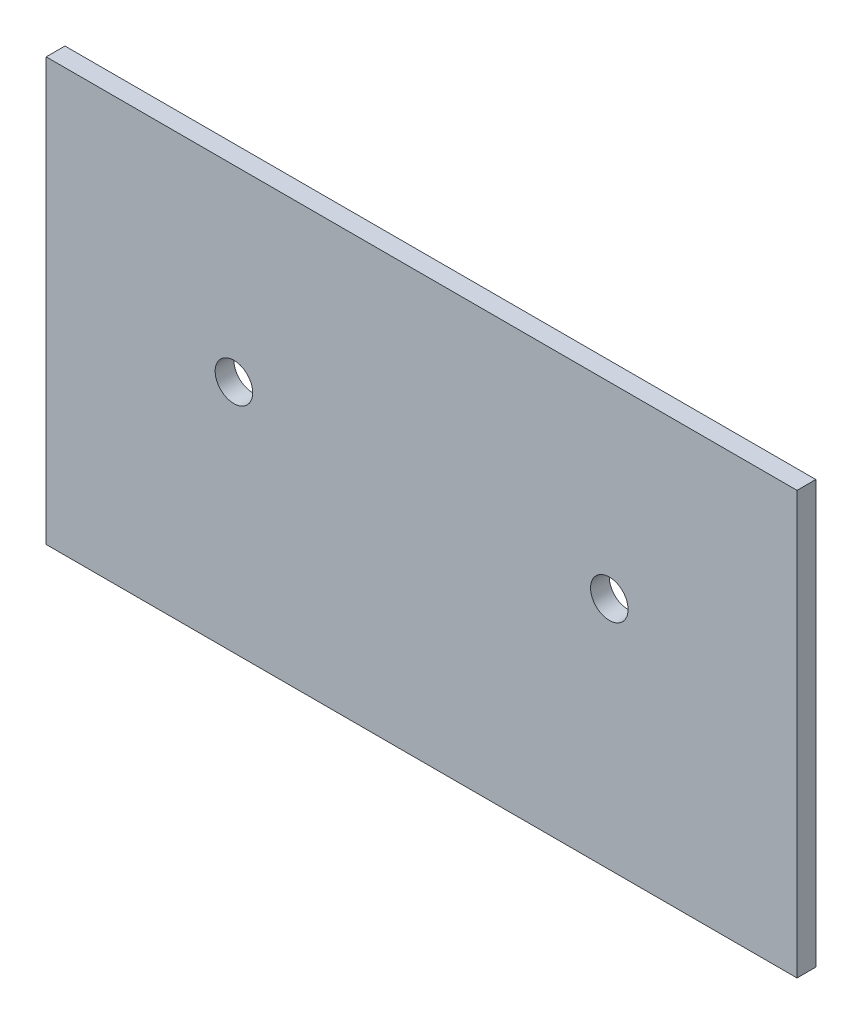
ISO-10303-21;
HEADER;
FILE_DESCRIPTION(('STEP AP214'),'2;1');
FILE_NAME('part.step','',(''),(''),'','','');
FILE_SCHEMA(('AUTOMOTIVE_DESIGN { 1 0 10303 214 1 1 1 1 }'));
ENDSEC;
DATA;
#1=APPLICATION_CONTEXT('core data for automotive mechanical design processes');
#2=APPLICATION_PROTOCOL_DEFINITION('international standard','automotive_design',2000,#1);
#3=PRODUCT_CONTEXT('',#1,'mechanical');
#4=PRODUCT('Part','Part','',(#3));
#5=PRODUCT_RELATED_PRODUCT_CATEGORY('part','',(#4));
#6=PRODUCT_DEFINITION_FORMATION('','',#4);
#7=PRODUCT_DEFINITION_CONTEXT('part definition',#1,'design');
#8=PRODUCT_DEFINITION('design','',#6,#7);
#9=PRODUCT_DEFINITION_SHAPE('','',#8);
#10=(LENGTH_UNIT() NAMED_UNIT(*) SI_UNIT(.MILLI.,.METRE.));
#11=(NAMED_UNIT(*) PLANE_ANGLE_UNIT() SI_UNIT($,.RADIAN.));
#12=(NAMED_UNIT(*) SI_UNIT($,.STERADIAN.) SOLID_ANGLE_UNIT());
#13=UNCERTAINTY_MEASURE_WITH_UNIT(LENGTH_MEASURE(1.E-05),#10,'distance_accuracy_value','');
#14=(GEOMETRIC_REPRESENTATION_CONTEXT(3) GLOBAL_UNCERTAINTY_ASSIGNED_CONTEXT((#13)) GLOBAL_UNIT_ASSIGNED_CONTEXT((#10,
#11,#12)) REPRESENTATION_CONTEXT('',''));
#15=CARTESIAN_POINT('',(0.,0.,0.));
#16=DIRECTION('',(0.,0.,1.));
#17=DIRECTION('',(1.,0.,0.));
#18=AXIS2_PLACEMENT_3D('',#15,#16,#17);
#19=CARTESIAN_POINT('',(40.,22.5,2.));
#20=DIRECTION('',(-1.,0.,0.));
#21=DIRECTION('',(0.,0.,1.));
#22=AXIS2_PLACEMENT_3D('',#19,#20,#21);
#23=PLANE('',#22);
#24=DIRECTION('',(0.,1.,0.));
#25=VECTOR('',#24,1.);
#26=CARTESIAN_POINT('',(40.,22.5,0.));
#27=LINE('',#26,#25);
#28=CARTESIAN_POINT('',(40.,-22.5,0.));
#29=VERTEX_POINT('',#28);
#30=CARTESIAN_POINT('',(40.,22.5,0.));
#31=VERTEX_POINT('',#30);
#32=EDGE_CURVE('E99',#29,#31,#27,.T.);
#33=ORIENTED_EDGE('',*,*,#32,.T.);
#34=DIRECTION('',(0.,0.,-1.));
#35=VECTOR('',#34,1.);
#36=CARTESIAN_POINT('',(40.,22.5,2.));
#37=LINE('',#36,#35);
#38=CARTESIAN_POINT('',(40.,22.5,2.));
#39=VERTEX_POINT('',#38);
#40=EDGE_CURVE('E11',#39,#31,#37,.T.);
#41=ORIENTED_EDGE('',*,*,#40,.F.);
#42=DIRECTION('',(0.,1.,0.));
#43=VECTOR('',#42,1.);
#44=CARTESIAN_POINT('',(40.,22.5,2.));
#45=LINE('',#44,#43);
#46=CARTESIAN_POINT('',(40.,-22.5,2.));
#47=VERTEX_POINT('',#46);
#48=EDGE_CURVE('E87',#47,#39,#45,.T.);
#49=ORIENTED_EDGE('',*,*,#48,.F.);
#50=DIRECTION('',(0.,0.,-1.));
#51=VECTOR('',#50,1.);
#52=CARTESIAN_POINT('',(40.,-22.5,2.));
#53=LINE('',#52,#51);
#54=EDGE_CURVE('E95',#47,#29,#53,.T.);
#55=ORIENTED_EDGE('',*,*,#54,.T.);
#56=EDGE_LOOP('',(#33,#41,#49,#55));
#57=FACE_BOUND('',#56,.T.);
#58=ADVANCED_FACE('F36',(#57),#23,.F.);
#59=CARTESIAN_POINT('',(-40.,22.5,2.));
#60=DIRECTION('',(0.,-1.,0.));
#61=DIRECTION('',(0.,0.,-1.));
#62=AXIS2_PLACEMENT_3D('',#59,#60,#61);
#63=PLANE('',#62);
#64=DIRECTION('',(-1.,0.,0.));
#65=VECTOR('',#64,1.);
#66=CARTESIAN_POINT('',(-40.,22.5,0.));
#67=LINE('',#66,#65);
#68=CARTESIAN_POINT('',(-40.,22.5,0.));
#69=VERTEX_POINT('',#68);
#70=EDGE_CURVE('E91',#31,#69,#67,.T.);
#71=ORIENTED_EDGE('',*,*,#70,.T.);
#72=DIRECTION('',(0.,0.,-1.));
#73=VECTOR('',#72,1.);
#74=CARTESIAN_POINT('',(-40.,22.5,2.));
#75=LINE('',#74,#73);
#76=CARTESIAN_POINT('',(-40.,22.5,2.));
#77=VERTEX_POINT('',#76);
#78=EDGE_CURVE('E44',#77,#69,#75,.T.);
#79=ORIENTED_EDGE('',*,*,#78,.F.);
#80=DIRECTION('',(-1.,0.,0.));
#81=VECTOR('',#80,1.);
#82=CARTESIAN_POINT('',(-40.,22.5,2.));
#83=LINE('',#82,#81);
#84=EDGE_CURVE('E82',#39,#77,#83,.T.);
#85=ORIENTED_EDGE('',*,*,#84,.F.);
#86=ORIENTED_EDGE('',*,*,#40,.T.);
#87=EDGE_LOOP('',(#71,#79,#85,#86));
#88=FACE_BOUND('',#87,.T.);
#89=ADVANCED_FACE('F90',(#88),#63,.F.);
#90=CARTESIAN_POINT('',(-40.,22.5,2.));
#91=DIRECTION('',(1.,0.,0.));
#92=DIRECTION('',(0.,1.,0.));
#93=AXIS2_PLACEMENT_3D('',#90,#91,#92);
#94=PLANE('',#93);
#95=DIRECTION('',(0.,-1.,0.));
#96=VECTOR('',#95,1.);
#97=CARTESIAN_POINT('',(-40.,22.5,0.));
#98=LINE('',#97,#96);
#99=CARTESIAN_POINT('',(-40.,-22.5,0.));
#100=VERTEX_POINT('',#99);
#101=EDGE_CURVE('E69',#69,#100,#98,.T.);
#102=ORIENTED_EDGE('',*,*,#101,.T.);
#103=DIRECTION('',(0.,0.,-1.));
#104=VECTOR('',#103,1.);
#105=CARTESIAN_POINT('',(-40.,-22.5,2.));
#106=LINE('',#105,#104);
#107=CARTESIAN_POINT('',(-40.,-22.5,2.));
#108=VERTEX_POINT('',#107);
#109=EDGE_CURVE('E92',#108,#100,#106,.T.);
#110=ORIENTED_EDGE('',*,*,#109,.F.);
#111=DIRECTION('',(0.,-1.,0.));
#112=VECTOR('',#111,1.);
#113=CARTESIAN_POINT('',(-40.,22.5,2.));
#114=LINE('',#113,#112);
#115=EDGE_CURVE('E85',#77,#108,#114,.T.);
#116=ORIENTED_EDGE('',*,*,#115,.F.);
#117=ORIENTED_EDGE('',*,*,#78,.T.);
#118=EDGE_LOOP('',(#102,#110,#116,#117));
#119=FACE_BOUND('',#118,.T.);
#120=ADVANCED_FACE('F93',(#119),#94,.F.);
#121=CARTESIAN_POINT('',(-40.,-22.5,2.));
#122=DIRECTION('',(0.,1.,0.));
#123=DIRECTION('',(0.,0.,1.));
#124=AXIS2_PLACEMENT_3D('',#121,#122,#123);
#125=PLANE('',#124);
#126=DIRECTION('',(1.,0.,0.));
#127=VECTOR('',#126,1.);
#128=CARTESIAN_POINT('',(-40.,-22.5,0.));
#129=LINE('',#128,#127);
#130=EDGE_CURVE('E75',#100,#29,#129,.T.);
#131=ORIENTED_EDGE('',*,*,#130,.T.);
#132=ORIENTED_EDGE('',*,*,#54,.F.);
#133=DIRECTION('',(1.,0.,0.));
#134=VECTOR('',#133,1.);
#135=CARTESIAN_POINT('',(-40.,-22.5,2.));
#136=LINE('',#135,#134);
#137=EDGE_CURVE('E52',#108,#47,#136,.T.);
#138=ORIENTED_EDGE('',*,*,#137,.F.);
#139=ORIENTED_EDGE('',*,*,#109,.T.);
#140=EDGE_LOOP('',(#131,#132,#138,#139));
#141=FACE_BOUND('',#140,.T.);
#142=ADVANCED_FACE('F107',(#141),#125,.F.);
#143=CARTESIAN_POINT('',(0.,0.,2.));
#144=DIRECTION('',(0.,0.,1.));
#145=DIRECTION('',(1.,0.,0.));
#146=AXIS2_PLACEMENT_3D('',#143,#144,#145);
#147=PLANE('',#146);
#148=CARTESIAN_POINT('',(-20.,2.5,2.));
#149=DIRECTION('',(0.,0.,1.));
#150=DIRECTION('',(1.,0.,0.));
#151=AXIS2_PLACEMENT_3D('',#148,#149,#150);
#152=CIRCLE('',#151,2.);
#153=CARTESIAN_POINT('',(-18.,2.5,2.));
#154=VERTEX_POINT('',#153);
#155=EDGE_CURVE('E119',#154,#154,#152,.T.);
#156=ORIENTED_EDGE('',*,*,#155,.F.);
#157=EDGE_LOOP('',(#156));
#158=FACE_BOUND('',#157,.T.);
#159=CARTESIAN_POINT('',(20.,2.5,2.));
#160=DIRECTION('',(0.,0.,1.));
#161=DIRECTION('',(1.,0.,0.));
#162=AXIS2_PLACEMENT_3D('',#159,#160,#161);
#163=CIRCLE('',#162,2.);
#164=CARTESIAN_POINT('',(22.,2.5,2.));
#165=VERTEX_POINT('',#164);
#166=EDGE_CURVE('E113',#165,#165,#163,.T.);
#167=ORIENTED_EDGE('',*,*,#166,.F.);
#168=EDGE_LOOP('',(#167));
#169=FACE_BOUND('',#168,.T.);
#170=ORIENTED_EDGE('',*,*,#48,.T.);
#171=ORIENTED_EDGE('',*,*,#84,.T.);
#172=ORIENTED_EDGE('',*,*,#115,.T.);
#173=ORIENTED_EDGE('',*,*,#137,.T.);
#174=EDGE_LOOP('',(#170,#171,#172,#173));
#175=FACE_BOUND('',#174,.T.);
#176=ADVANCED_FACE('F83',(#158,#169,#175),#147,.T.);
#177=CARTESIAN_POINT('',(0.,0.,0.));
#178=DIRECTION('',(0.,0.,1.));
#179=DIRECTION('',(1.,0.,0.));
#180=AXIS2_PLACEMENT_3D('',#177,#178,#179);
#181=PLANE('',#180);
#182=CARTESIAN_POINT('',(-20.,2.5,0.));
#183=DIRECTION('',(0.,0.,1.));
#184=DIRECTION('',(1.,0.,0.));
#185=AXIS2_PLACEMENT_3D('',#182,#183,#184);
#186=CIRCLE('',#185,2.);
#187=CARTESIAN_POINT('',(-18.,2.5,0.));
#188=VERTEX_POINT('',#187);
#189=EDGE_CURVE('E102',#188,#188,#186,.T.);
#190=ORIENTED_EDGE('',*,*,#189,.T.);
#191=EDGE_LOOP('',(#190));
#192=FACE_BOUND('',#191,.T.);
#193=CARTESIAN_POINT('',(20.,2.5,0.));
#194=DIRECTION('',(0.,0.,1.));
#195=DIRECTION('',(1.,0.,0.));
#196=AXIS2_PLACEMENT_3D('',#193,#194,#195);
#197=CIRCLE('',#196,2.);
#198=CARTESIAN_POINT('',(22.,2.5,0.));
#199=VERTEX_POINT('',#198);
#200=EDGE_CURVE('E116',#199,#199,#197,.T.);
#201=ORIENTED_EDGE('',*,*,#200,.T.);
#202=EDGE_LOOP('',(#201));
#203=FACE_BOUND('',#202,.T.);
#204=ORIENTED_EDGE('',*,*,#32,.F.);
#205=ORIENTED_EDGE('',*,*,#130,.F.);
#206=ORIENTED_EDGE('',*,*,#101,.F.);
#207=ORIENTED_EDGE('',*,*,#70,.F.);
#208=EDGE_LOOP('',(#204,#205,#206,#207));
#209=FACE_BOUND('',#208,.T.);
#210=ADVANCED_FACE('F110',(#192,#203,#209),#181,.F.);
#211=CARTESIAN_POINT('',(20.,2.5,0.));
#212=DIRECTION('',(0.,0.,1.));
#213=DIRECTION('',(1.,0.,0.));
#214=AXIS2_PLACEMENT_3D('',#211,#212,#213);
#215=CYLINDRICAL_SURFACE('',#214,2.);
#216=ORIENTED_EDGE('',*,*,#200,.F.);
#217=EDGE_LOOP('',(#216));
#218=FACE_BOUND('',#217,.T.);
#219=ORIENTED_EDGE('',*,*,#166,.T.);
#220=EDGE_LOOP('',(#219));
#221=FACE_BOUND('',#220,.T.);
#222=ADVANCED_FACE('F130',(#218,#221),#215,.F.);
#223=CARTESIAN_POINT('',(-20.,2.5,0.));
#224=DIRECTION('',(0.,0.,1.));
#225=DIRECTION('',(1.,0.,0.));
#226=AXIS2_PLACEMENT_3D('',#223,#224,#225);
#227=CYLINDRICAL_SURFACE('',#226,2.);
#228=ORIENTED_EDGE('',*,*,#189,.F.);
#229=EDGE_LOOP('',(#228));
#230=FACE_BOUND('',#229,.T.);
#231=ORIENTED_EDGE('',*,*,#155,.T.);
#232=EDGE_LOOP('',(#231));
#233=FACE_BOUND('',#232,.T.);
#234=ADVANCED_FACE('F127',(#230,#233),#227,.F.);
#235=CLOSED_SHELL('',(#58,#89,#120,#142,#176,#210,#222,#234));
#236=MANIFOLD_SOLID_BREP('B2',#235);
#237=ADVANCED_BREP_SHAPE_REPRESENTATION('',(#18,#236),#14);
#238=SHAPE_DEFINITION_REPRESENTATION(#9,#237);
ENDSEC;
END-ISO-10303-21;
